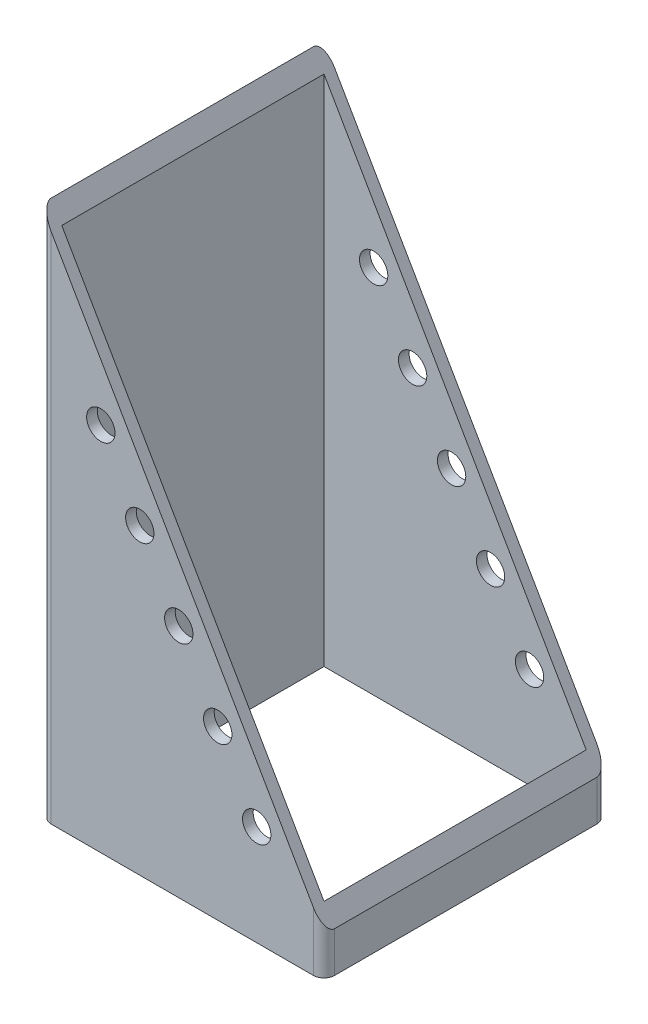
ISO-10303-21;
HEADER;
FILE_DESCRIPTION(('STEP AP214'),'2;1');
FILE_NAME('part.step','',(''),(''),'','','');
FILE_SCHEMA(('AUTOMOTIVE_DESIGN { 1 0 10303 214 1 1 1 1 }'));
ENDSEC;
DATA;
#1=APPLICATION_CONTEXT('core data for automotive mechanical design processes');
#2=APPLICATION_PROTOCOL_DEFINITION('international standard','automotive_design',2000,#1);
#3=PRODUCT_CONTEXT('',#1,'mechanical');
#4=PRODUCT('Part','Part','',(#3));
#5=PRODUCT_RELATED_PRODUCT_CATEGORY('part','',(#4));
#6=PRODUCT_DEFINITION_FORMATION('','',#4);
#7=PRODUCT_DEFINITION_CONTEXT('part definition',#1,'design');
#8=PRODUCT_DEFINITION('design','',#6,#7);
#9=PRODUCT_DEFINITION_SHAPE('','',#8);
#10=(LENGTH_UNIT() NAMED_UNIT(*) SI_UNIT(.MILLI.,.METRE.));
#11=(NAMED_UNIT(*) PLANE_ANGLE_UNIT() SI_UNIT($,.RADIAN.));
#12=(NAMED_UNIT(*) SI_UNIT($,.STERADIAN.) SOLID_ANGLE_UNIT());
#13=UNCERTAINTY_MEASURE_WITH_UNIT(LENGTH_MEASURE(1.E-05),#10,'distance_accuracy_value','');
#14=(GEOMETRIC_REPRESENTATION_CONTEXT(3) GLOBAL_UNCERTAINTY_ASSIGNED_CONTEXT((#13)) GLOBAL_UNIT_ASSIGNED_CONTEXT((#10,
#11,#12)) REPRESENTATION_CONTEXT('',''));
#15=CARTESIAN_POINT('',(0.,0.,0.));
#16=DIRECTION('',(0.,0.,1.));
#17=DIRECTION('',(1.,0.,0.));
#18=AXIS2_PLACEMENT_3D('',#15,#16,#17);
#19=CARTESIAN_POINT('',(-40.,150.,-40.01));
#20=DIRECTION('',(-0.866025403784442,-0.499999999999995,0.));
#21=DIRECTION('',(0.499999999999995,-0.866025403784442,0.));
#22=AXIS2_PLACEMENT_3D('',#19,#20,#21);
#23=PLANE('',#22);
#24=DIRECTION('',(0.,0.,1.));
#25=VECTOR('',#24,1.);
#26=CARTESIAN_POINT('',(37.,16.6320878171947,-37.0000000000002));
#27=LINE('',#26,#25);
#28=CARTESIAN_POINT('',(37.,16.6320878171946,-37.));
#29=VERTEX_POINT('',#28);
#30=CARTESIAN_POINT('',(37.,16.6320878171946,37.));
#31=VERTEX_POINT('',#30);
#32=EDGE_CURVE('E135',#29,#31,#27,.T.);
#33=ORIENTED_EDGE('',*,*,#32,.T.);
#34=DIRECTION('',(-0.499999999999995,0.866025403784442,0.));
#35=VECTOR('',#34,1.);
#36=CARTESIAN_POINT('',(-104.201905283832,261.200961894324,37.));
#37=LINE('',#36,#35);
#38=CARTESIAN_POINT('',(-37.,144.803847577293,37.));
#39=VERTEX_POINT('',#38);
#40=EDGE_CURVE('E218',#31,#39,#37,.T.);
#41=ORIENTED_EDGE('',*,*,#40,.T.);
#42=DIRECTION('',(0.,0.,-1.));
#43=VECTOR('',#42,1.);
#44=CARTESIAN_POINT('',(-37.,144.803847577293,-37.0000000000001));
#45=LINE('',#44,#43);
#46=CARTESIAN_POINT('',(-37.,144.803847577293,-37.));
#47=VERTEX_POINT('',#46);
#48=EDGE_CURVE('E221',#39,#47,#45,.T.);
#49=ORIENTED_EDGE('',*,*,#48,.T.);
#50=DIRECTION('',(0.499999999999995,-0.866025403784442,0.));
#51=VECTOR('',#50,1.);
#52=CARTESIAN_POINT('',(-104.201905283832,261.200961894324,-37.));
#53=LINE('',#52,#51);
#54=EDGE_CURVE('E224',#47,#29,#53,.T.);
#55=ORIENTED_EDGE('',*,*,#54,.T.);
#56=EDGE_LOOP('',(#33,#41,#49,#55));
#57=FACE_BOUND('',#56,.T.);
#58=CARTESIAN_POINT('',(-37.,144.803847577293,37.));
#59=DIRECTION('',(-0.866025403784442,-0.499999999999995,0.));
#60=DIRECTION('',(0.499999999999995,-0.866025403784442,0.));
#61=AXIS2_PLACEMENT_3D('',#58,#59,#60);
#62=ELLIPSE('',#61,6.00000000000006,3.);
#63=CARTESIAN_POINT('',(-40.,150.,37.));
#64=VERTEX_POINT('',#63);
#65=CARTESIAN_POINT('',(-37.,144.803847577293,40.));
#66=VERTEX_POINT('',#65);
#67=EDGE_CURVE('E215',#64,#66,#62,.F.);
#68=ORIENTED_EDGE('',*,*,#67,.T.);
#69=DIRECTION('',(-0.499999999999995,0.866025403784442,0.));
#70=VECTOR('',#69,1.);
#71=CARTESIAN_POINT('',(-104.951905283832,262.500000000001,40.));
#72=LINE('',#71,#70);
#73=CARTESIAN_POINT('',(37.,16.6320878171947,40.));
#74=VERTEX_POINT('',#73);
#75=EDGE_CURVE('E202',#74,#66,#72,.T.);
#76=ORIENTED_EDGE('',*,*,#75,.F.);
#77=CARTESIAN_POINT('',(37.,16.6320878171947,37.));
#78=DIRECTION('',(-0.866025403784442,-0.499999999999995,0.));
#79=DIRECTION('',(0.499999999999995,-0.866025403784442,0.));
#80=AXIS2_PLACEMENT_3D('',#77,#78,#79);
#81=ELLIPSE('',#80,6.00000000000006,3.);
#82=CARTESIAN_POINT('',(40.,11.435935394488,37.));
#83=VERTEX_POINT('',#82);
#84=EDGE_CURVE('E44',#74,#83,#81,.F.);
#85=ORIENTED_EDGE('',*,*,#84,.T.);
#86=DIRECTION('',(0.,0.,1.));
#87=VECTOR('',#86,1.);
#88=CARTESIAN_POINT('',(40.,11.435935394488,-40.0000000000001));
#89=LINE('',#88,#87);
#90=CARTESIAN_POINT('',(40.,11.435935394488,-37.));
#91=VERTEX_POINT('',#90);
#92=EDGE_CURVE('E208',#91,#83,#89,.T.);
#93=ORIENTED_EDGE('',*,*,#92,.F.);
#94=CARTESIAN_POINT('',(37.,16.6320878171947,-37.));
#95=DIRECTION('',(-0.866025403784442,-0.499999999999995,0.));
#96=DIRECTION('',(0.499999999999995,-0.866025403784442,0.));
#97=AXIS2_PLACEMENT_3D('',#94,#95,#96);
#98=ELLIPSE('',#97,6.00000000000006,3.);
#99=CARTESIAN_POINT('',(37.,16.6320878171947,-40.));
#100=VERTEX_POINT('',#99);
#101=EDGE_CURVE('E11',#91,#100,#98,.F.);
#102=ORIENTED_EDGE('',*,*,#101,.T.);
#103=DIRECTION('',(0.499999999999995,-0.866025403784442,0.));
#104=VECTOR('',#103,1.);
#105=CARTESIAN_POINT('',(-104.951905283832,262.500000000001,-40.));
#106=LINE('',#105,#104);
#107=CARTESIAN_POINT('',(-37.,144.803847577293,-40.));
#108=VERTEX_POINT('',#107);
#109=EDGE_CURVE('E58',#108,#100,#106,.T.);
#110=ORIENTED_EDGE('',*,*,#109,.F.);
#111=CARTESIAN_POINT('',(-37.,144.803847577293,-37.));
#112=DIRECTION('',(-0.866025403784442,-0.499999999999995,0.));
#113=DIRECTION('',(0.499999999999995,-0.866025403784442,0.));
#114=AXIS2_PLACEMENT_3D('',#111,#112,#113);
#115=ELLIPSE('',#114,6.00000000000006,3.);
#116=CARTESIAN_POINT('',(-40.,150.,-37.));
#117=VERTEX_POINT('',#116);
#118=EDGE_CURVE('E212',#108,#117,#115,.F.);
#119=ORIENTED_EDGE('',*,*,#118,.T.);
#120=DIRECTION('',(0.,0.,-1.));
#121=VECTOR('',#120,1.);
#122=CARTESIAN_POINT('',(-40.,150.,-40.0000000000001));
#123=LINE('',#122,#121);
#124=EDGE_CURVE('E205',#64,#117,#123,.T.);
#125=ORIENTED_EDGE('',*,*,#124,.F.);
#126=EDGE_LOOP('',(#68,#76,#85,#93,#102,#110,#119,#125));
#127=FACE_BOUND('',#126,.T.);
#128=ADVANCED_FACE('F36',(#57,#127),#23,.F.);
#129=CARTESIAN_POINT('',(0.,0.,0.));
#130=DIRECTION('',(0.,1.,0.));
#131=DIRECTION('',(0.,0.,1.));
#132=AXIS2_PLACEMENT_3D('',#129,#130,#131);
#133=PLANE('',#132);
#134=DIRECTION('',(1.,0.,0.));
#135=VECTOR('',#134,1.);
#136=CARTESIAN_POINT('',(-40.,0.,40.));
#137=LINE('',#136,#135);
#138=CARTESIAN_POINT('',(-37.,0.,40.));
#139=VERTEX_POINT('',#138);
#140=CARTESIAN_POINT('',(37.,0.,40.));
#141=VERTEX_POINT('',#140);
#142=EDGE_CURVE('E173',#139,#141,#137,.T.);
#143=ORIENTED_EDGE('',*,*,#142,.F.);
#144=CARTESIAN_POINT('',(-37.,0.,37.));
#145=DIRECTION('',(0.,1.,0.));
#146=DIRECTION('',(0.,0.,1.));
#147=AXIS2_PLACEMENT_3D('',#144,#145,#146);
#148=CIRCLE('',#147,3.);
#149=CARTESIAN_POINT('',(-40.,0.,37.));
#150=VERTEX_POINT('',#149);
#151=EDGE_CURVE('E187',#139,#150,#148,.F.);
#152=ORIENTED_EDGE('',*,*,#151,.T.);
#153=DIRECTION('',(0.,0.,1.));
#154=VECTOR('',#153,1.);
#155=CARTESIAN_POINT('',(-40.,0.,-40.));
#156=LINE('',#155,#154);
#157=CARTESIAN_POINT('',(-40.,0.,-37.));
#158=VERTEX_POINT('',#157);
#159=EDGE_CURVE('E170',#158,#150,#156,.T.);
#160=ORIENTED_EDGE('',*,*,#159,.F.);
#161=CARTESIAN_POINT('',(-37.,0.,-37.));
#162=DIRECTION('',(0.,1.,0.));
#163=DIRECTION('',(0.,0.,1.));
#164=AXIS2_PLACEMENT_3D('',#161,#162,#163);
#165=CIRCLE('',#164,3.);
#166=CARTESIAN_POINT('',(-37.,0.,-40.));
#167=VERTEX_POINT('',#166);
#168=EDGE_CURVE('E185',#158,#167,#165,.F.);
#169=ORIENTED_EDGE('',*,*,#168,.T.);
#170=DIRECTION('',(-1.,0.,0.));
#171=VECTOR('',#170,1.);
#172=CARTESIAN_POINT('',(-40.,0.,-40.));
#173=LINE('',#172,#171);
#174=CARTESIAN_POINT('',(37.,0.,-40.));
#175=VERTEX_POINT('',#174);
#176=EDGE_CURVE('E167',#175,#167,#173,.T.);
#177=ORIENTED_EDGE('',*,*,#176,.F.);
#178=CARTESIAN_POINT('',(37.,0.,-37.));
#179=DIRECTION('',(0.,1.,0.));
#180=DIRECTION('',(0.,0.,1.));
#181=AXIS2_PLACEMENT_3D('',#178,#179,#180);
#182=CIRCLE('',#181,3.);
#183=CARTESIAN_POINT('',(40.,0.,-37.));
#184=VERTEX_POINT('',#183);
#185=EDGE_CURVE('E181',#175,#184,#182,.F.);
#186=ORIENTED_EDGE('',*,*,#185,.T.);
#187=DIRECTION('',(0.,0.,-1.));
#188=VECTOR('',#187,1.);
#189=CARTESIAN_POINT('',(40.,0.,-40.));
#190=LINE('',#189,#188);
#191=CARTESIAN_POINT('',(40.,0.,37.));
#192=VERTEX_POINT('',#191);
#193=EDGE_CURVE('E137',#192,#184,#190,.T.);
#194=ORIENTED_EDGE('',*,*,#193,.F.);
#195=CARTESIAN_POINT('',(37.,0.,37.));
#196=DIRECTION('',(0.,1.,0.));
#197=DIRECTION('',(0.,0.,1.));
#198=AXIS2_PLACEMENT_3D('',#195,#196,#197);
#199=CIRCLE('',#198,3.);
#200=EDGE_CURVE('E183',#192,#141,#199,.F.);
#201=ORIENTED_EDGE('',*,*,#200,.T.);
#202=EDGE_LOOP('',(#143,#152,#160,#169,#177,#186,#194,#201));
#203=FACE_BOUND('',#202,.T.);
#204=DIRECTION('',(0.,0.,-1.));
#205=VECTOR('',#204,1.);
#206=CARTESIAN_POINT('',(37.,0.,-37.));
#207=LINE('',#206,#205);
#208=CARTESIAN_POINT('',(37.,0.,37.));
#209=VERTEX_POINT('',#208);
#210=CARTESIAN_POINT('',(37.,0.,-37.));
#211=VERTEX_POINT('',#210);
#212=EDGE_CURVE('E132',#209,#211,#207,.T.);
#213=ORIENTED_EDGE('',*,*,#212,.T.);
#214=DIRECTION('',(-1.,0.,0.));
#215=VECTOR('',#214,1.);
#216=CARTESIAN_POINT('',(-37.,0.,-37.));
#217=LINE('',#216,#215);
#218=CARTESIAN_POINT('',(-37.,0.,-37.));
#219=VERTEX_POINT('',#218);
#220=EDGE_CURVE('E141',#211,#219,#217,.T.);
#221=ORIENTED_EDGE('',*,*,#220,.T.);
#222=DIRECTION('',(0.,0.,1.));
#223=VECTOR('',#222,1.);
#224=CARTESIAN_POINT('',(-37.,0.,-37.));
#225=LINE('',#224,#223);
#226=CARTESIAN_POINT('',(-37.,0.,37.));
#227=VERTEX_POINT('',#226);
#228=EDGE_CURVE('E147',#219,#227,#225,.T.);
#229=ORIENTED_EDGE('',*,*,#228,.T.);
#230=DIRECTION('',(1.,0.,0.));
#231=VECTOR('',#230,1.);
#232=CARTESIAN_POINT('',(-37.,0.,37.));
#233=LINE('',#232,#231);
#234=EDGE_CURVE('E151',#227,#209,#233,.T.);
#235=ORIENTED_EDGE('',*,*,#234,.T.);
#236=EDGE_LOOP('',(#213,#221,#229,#235));
#237=FACE_BOUND('',#236,.T.);
#238=ADVANCED_FACE('F149',(#203,#237),#133,.F.);
#239=CARTESIAN_POINT('',(40.,300.,-40.));
#240=DIRECTION('',(-1.,0.,0.));
#241=DIRECTION('',(0.,0.,1.));
#242=AXIS2_PLACEMENT_3D('',#239,#240,#241);
#243=PLANE('',#242);
#244=DIRECTION('',(0.,-1.,0.));
#245=VECTOR('',#244,1.);
#246=CARTESIAN_POINT('',(40.,300.,-37.));
#247=LINE('',#246,#245);
#248=EDGE_CURVE('E198',#184,#91,#247,.F.);
#249=ORIENTED_EDGE('',*,*,#248,.T.);
#250=ORIENTED_EDGE('',*,*,#92,.T.);
#251=DIRECTION('',(0.,-1.,0.));
#252=VECTOR('',#251,1.);
#253=CARTESIAN_POINT('',(40.,300.,37.));
#254=LINE('',#253,#252);
#255=EDGE_CURVE('E201',#83,#192,#254,.T.);
#256=ORIENTED_EDGE('',*,*,#255,.T.);
#257=ORIENTED_EDGE('',*,*,#193,.T.);
#258=EDGE_LOOP('',(#249,#250,#256,#257));
#259=FACE_BOUND('',#258,.T.);
#260=ADVANCED_FACE('F314',(#259),#243,.F.);
#261=CARTESIAN_POINT('',(-40.,300.,-40.));
#262=DIRECTION('',(0.,0.,1.));
#263=DIRECTION('',(1.,0.,0.));
#264=AXIS2_PLACEMENT_3D('',#261,#262,#263);
#265=PLANE('',#264);
#266=CARTESIAN_POINT('',(-22.9881489732215,104.534609690826,-40.));
#267=DIRECTION('',(0.,0.,-1.));
#268=DIRECTION('',(-1.,0.,0.));
#269=AXIS2_PLACEMENT_3D('',#266,#267,#268);
#270=CIRCLE('',#269,4.00000000000001);
#271=CARTESIAN_POINT('',(-26.9881489732215,104.534609690826,-40.));
#272=VERTEX_POINT('',#271);
#273=EDGE_CURVE('E260',#272,#272,#270,.T.);
#274=ORIENTED_EDGE('',*,*,#273,.F.);
#275=EDGE_LOOP('',(#274));
#276=FACE_BOUND('',#275,.T.);
#277=CARTESIAN_POINT('',(-11.9881489732214,85.4820508075689,-40.));
#278=DIRECTION('',(0.,0.,-1.));
#279=DIRECTION('',(-1.,0.,0.));
#280=AXIS2_PLACEMENT_3D('',#277,#278,#279);
#281=CIRCLE('',#280,4.00000000000001);
#282=CARTESIAN_POINT('',(-15.9881489732214,85.4820508075689,-40.));
#283=VERTEX_POINT('',#282);
#284=EDGE_CURVE('E267',#283,#283,#281,.T.);
#285=ORIENTED_EDGE('',*,*,#284,.F.);
#286=EDGE_LOOP('',(#285));
#287=FACE_BOUND('',#286,.T.);
#288=CARTESIAN_POINT('',(21.0118510267788,28.324374157796,-40.));
#289=DIRECTION('',(0.,0.,-1.));
#290=DIRECTION('',(-1.,0.,0.));
#291=AXIS2_PLACEMENT_3D('',#288,#289,#290);
#292=CIRCLE('',#291,4.00000000000001);
#293=CARTESIAN_POINT('',(17.0118510267788,28.324374157796,-40.));
#294=VERTEX_POINT('',#293);
#295=EDGE_CURVE('E273',#294,#294,#292,.T.);
#296=ORIENTED_EDGE('',*,*,#295,.F.);
#297=EDGE_LOOP('',(#296));
#298=FACE_BOUND('',#297,.T.);
#299=CARTESIAN_POINT('',(10.0118510267787,47.3769330410536,-40.));
#300=DIRECTION('',(0.,0.,-1.));
#301=DIRECTION('',(-1.,0.,0.));
#302=AXIS2_PLACEMENT_3D('',#299,#300,#301);
#303=CIRCLE('',#302,4.00000000000001);
#304=CARTESIAN_POINT('',(6.01185102677873,47.3769330410536,-40.));
#305=VERTEX_POINT('',#304);
#306=EDGE_CURVE('E259',#305,#305,#303,.T.);
#307=ORIENTED_EDGE('',*,*,#306,.F.);
#308=EDGE_LOOP('',(#307));
#309=FACE_BOUND('',#308,.T.);
#310=CARTESIAN_POINT('',(-0.988148973221331,66.4294919243113,-40.));
#311=DIRECTION('',(0.,0.,-1.));
#312=DIRECTION('',(-1.,0.,0.));
#313=AXIS2_PLACEMENT_3D('',#310,#311,#312);
#314=CIRCLE('',#313,4.00000000000001);
#315=CARTESIAN_POINT('',(-4.98814897322134,66.4294919243113,-40.));
#316=VERTEX_POINT('',#315);
#317=EDGE_CURVE('E231',#316,#316,#314,.T.);
#318=ORIENTED_EDGE('',*,*,#317,.F.);
#319=EDGE_LOOP('',(#318));
#320=FACE_BOUND('',#319,.T.);
#321=DIRECTION('',(0.,-1.,0.));
#322=VECTOR('',#321,1.);
#323=CARTESIAN_POINT('',(-37.,300.,-40.));
#324=LINE('',#323,#322);
#325=EDGE_CURVE('E196',#167,#108,#324,.F.);
#326=ORIENTED_EDGE('',*,*,#325,.T.);
#327=ORIENTED_EDGE('',*,*,#109,.T.);
#328=DIRECTION('',(0.,-1.,0.));
#329=VECTOR('',#328,1.);
#330=CARTESIAN_POINT('',(37.,300.,-40.));
#331=LINE('',#330,#329);
#332=EDGE_CURVE('E194',#100,#175,#331,.T.);
#333=ORIENTED_EDGE('',*,*,#332,.T.);
#334=ORIENTED_EDGE('',*,*,#176,.T.);
#335=EDGE_LOOP('',(#326,#327,#333,#334));
#336=FACE_BOUND('',#335,.T.);
#337=ADVANCED_FACE('F337',(#276,#287,#298,#309,#320,#336),#265,.F.);
#338=CARTESIAN_POINT('',(-40.,300.,-40.));
#339=DIRECTION('',(1.,0.,0.));
#340=DIRECTION('',(0.,0.,-1.));
#341=AXIS2_PLACEMENT_3D('',#338,#339,#340);
#342=PLANE('',#341);
#343=DIRECTION('',(0.,-1.,0.));
#344=VECTOR('',#343,1.);
#345=CARTESIAN_POINT('',(-40.,300.,37.));
#346=LINE('',#345,#344);
#347=EDGE_CURVE('E191',#150,#64,#346,.F.);
#348=ORIENTED_EDGE('',*,*,#347,.T.);
#349=ORIENTED_EDGE('',*,*,#124,.T.);
#350=DIRECTION('',(0.,-1.,0.));
#351=VECTOR('',#350,1.);
#352=CARTESIAN_POINT('',(-40.,300.,-37.));
#353=LINE('',#352,#351);
#354=EDGE_CURVE('E189',#117,#158,#353,.T.);
#355=ORIENTED_EDGE('',*,*,#354,.T.);
#356=ORIENTED_EDGE('',*,*,#159,.T.);
#357=EDGE_LOOP('',(#348,#349,#355,#356));
#358=FACE_BOUND('',#357,.T.);
#359=ADVANCED_FACE('F341',(#358),#342,.F.);
#360=CARTESIAN_POINT('',(-40.,300.,40.));
#361=DIRECTION('',(0.,0.,-1.));
#362=DIRECTION('',(-1.,0.,0.));
#363=AXIS2_PLACEMENT_3D('',#360,#361,#362);
#364=PLANE('',#363);
#365=CARTESIAN_POINT('',(-22.9881489732215,104.534609690826,40.));
#366=DIRECTION('',(0.,0.,-1.));
#367=DIRECTION('',(-1.,0.,0.));
#368=AXIS2_PLACEMENT_3D('',#365,#366,#367);
#369=CIRCLE('',#368,4.00000000000001);
#370=CARTESIAN_POINT('',(-26.9881489732215,104.534609690826,40.));
#371=VERTEX_POINT('',#370);
#372=EDGE_CURVE('E264',#371,#371,#369,.T.);
#373=ORIENTED_EDGE('',*,*,#372,.T.);
#374=EDGE_LOOP('',(#373));
#375=FACE_BOUND('',#374,.T.);
#376=CARTESIAN_POINT('',(-11.9881489732214,85.4820508075689,40.));
#377=DIRECTION('',(0.,0.,-1.));
#378=DIRECTION('',(-1.,0.,0.));
#379=AXIS2_PLACEMENT_3D('',#376,#377,#378);
#380=CIRCLE('',#379,4.00000000000001);
#381=CARTESIAN_POINT('',(-15.9881489732214,85.4820508075689,40.));
#382=VERTEX_POINT('',#381);
#383=EDGE_CURVE('E263',#382,#382,#380,.T.);
#384=ORIENTED_EDGE('',*,*,#383,.T.);
#385=EDGE_LOOP('',(#384));
#386=FACE_BOUND('',#385,.T.);
#387=CARTESIAN_POINT('',(21.0118510267788,28.324374157796,40.));
#388=DIRECTION('',(0.,0.,-1.));
#389=DIRECTION('',(-1.,0.,0.));
#390=AXIS2_PLACEMENT_3D('',#387,#388,#389);
#391=CIRCLE('',#390,4.00000000000001);
#392=CARTESIAN_POINT('',(17.0118510267788,28.324374157796,40.));
#393=VERTEX_POINT('',#392);
#394=EDGE_CURVE('E270',#393,#393,#391,.T.);
#395=ORIENTED_EDGE('',*,*,#394,.T.);
#396=EDGE_LOOP('',(#395));
#397=FACE_BOUND('',#396,.T.);
#398=CARTESIAN_POINT('',(10.0118510267788,47.3769330410536,40.));
#399=DIRECTION('',(0.,0.,-1.));
#400=DIRECTION('',(-1.,0.,0.));
#401=AXIS2_PLACEMENT_3D('',#398,#399,#400);
#402=CIRCLE('',#401,4.00000000000001);
#403=CARTESIAN_POINT('',(6.01185102677874,47.3769330410536,40.));
#404=VERTEX_POINT('',#403);
#405=EDGE_CURVE('E276',#404,#404,#402,.T.);
#406=ORIENTED_EDGE('',*,*,#405,.T.);
#407=EDGE_LOOP('',(#406));
#408=FACE_BOUND('',#407,.T.);
#409=CARTESIAN_POINT('',(-0.988148973221317,66.4294919243113,40.));
#410=DIRECTION('',(0.,0.,-1.));
#411=DIRECTION('',(-1.,0.,0.));
#412=AXIS2_PLACEMENT_3D('',#409,#410,#411);
#413=CIRCLE('',#412,4.00000000000001);
#414=CARTESIAN_POINT('',(-4.98814897322132,66.4294919243113,40.));
#415=VERTEX_POINT('',#414);
#416=EDGE_CURVE('E256',#415,#415,#413,.T.);
#417=ORIENTED_EDGE('',*,*,#416,.T.);
#418=EDGE_LOOP('',(#417));
#419=FACE_BOUND('',#418,.T.);
#420=DIRECTION('',(0.,-1.,0.));
#421=VECTOR('',#420,1.);
#422=CARTESIAN_POINT('',(37.,300.,40.));
#423=LINE('',#422,#421);
#424=EDGE_CURVE('E176',#141,#74,#423,.F.);
#425=ORIENTED_EDGE('',*,*,#424,.T.);
#426=ORIENTED_EDGE('',*,*,#75,.T.);
#427=DIRECTION('',(0.,-1.,0.));
#428=VECTOR('',#427,1.);
#429=CARTESIAN_POINT('',(-37.,300.,40.));
#430=LINE('',#429,#428);
#431=EDGE_CURVE('E179',#66,#139,#430,.T.);
#432=ORIENTED_EDGE('',*,*,#431,.T.);
#433=ORIENTED_EDGE('',*,*,#142,.T.);
#434=EDGE_LOOP('',(#425,#426,#432,#433));
#435=FACE_BOUND('',#434,.T.);
#436=ADVANCED_FACE('F284',(#375,#386,#397,#408,#419,#435),#364,.F.);
#437=CARTESIAN_POINT('',(37.,300.,-37.));
#438=DIRECTION('',(-1.,0.,0.));
#439=DIRECTION('',(0.,0.,1.));
#440=AXIS2_PLACEMENT_3D('',#437,#438,#439);
#441=PLANE('',#440);
#442=ORIENTED_EDGE('',*,*,#32,.F.);
#443=DIRECTION('',(0.,-1.,0.));
#444=VECTOR('',#443,1.);
#445=CARTESIAN_POINT('',(37.,300.,-37.));
#446=LINE('',#445,#444);
#447=EDGE_CURVE('E127',#29,#211,#446,.T.);
#448=ORIENTED_EDGE('',*,*,#447,.T.);
#449=ORIENTED_EDGE('',*,*,#212,.F.);
#450=DIRECTION('',(0.,-1.,0.));
#451=VECTOR('',#450,1.);
#452=CARTESIAN_POINT('',(37.,300.,37.));
#453=LINE('',#452,#451);
#454=EDGE_CURVE('E160',#31,#209,#453,.T.);
#455=ORIENTED_EDGE('',*,*,#454,.F.);
#456=EDGE_LOOP('',(#442,#448,#449,#455));
#457=FACE_BOUND('',#456,.T.);
#458=ADVANCED_FACE('F129',(#457),#441,.T.);
#459=CARTESIAN_POINT('',(-37.,300.,-37.));
#460=DIRECTION('',(0.,0.,1.));
#461=DIRECTION('',(1.,0.,0.));
#462=AXIS2_PLACEMENT_3D('',#459,#460,#461);
#463=PLANE('',#462);
#464=CARTESIAN_POINT('',(-22.9881489732215,104.534609690826,-37.));
#465=DIRECTION('',(0.,0.,1.));
#466=DIRECTION('',(1.,0.,0.));
#467=AXIS2_PLACEMENT_3D('',#464,#465,#466);
#468=CIRCLE('',#467,4.00000000000001);
#469=CARTESIAN_POINT('',(-18.9881489732215,104.534609690826,-37.));
#470=VERTEX_POINT('',#469);
#471=EDGE_CURVE('E152',#470,#470,#468,.F.);
#472=ORIENTED_EDGE('',*,*,#471,.T.);
#473=EDGE_LOOP('',(#472));
#474=FACE_BOUND('',#473,.T.);
#475=CARTESIAN_POINT('',(-11.9881489732214,85.4820508075689,-37.));
#476=DIRECTION('',(0.,0.,1.));
#477=DIRECTION('',(1.,0.,0.));
#478=AXIS2_PLACEMENT_3D('',#475,#476,#477);
#479=CIRCLE('',#478,4.00000000000001);
#480=CARTESIAN_POINT('',(-7.98814897322139,85.4820508075689,-37.));
#481=VERTEX_POINT('',#480);
#482=EDGE_CURVE('E241',#481,#481,#479,.F.);
#483=ORIENTED_EDGE('',*,*,#482,.T.);
#484=EDGE_LOOP('',(#483));
#485=FACE_BOUND('',#484,.T.);
#486=CARTESIAN_POINT('',(21.0118510267788,28.324374157796,-37.));
#487=DIRECTION('',(0.,0.,1.));
#488=DIRECTION('',(1.,0.,0.));
#489=AXIS2_PLACEMENT_3D('',#486,#487,#488);
#490=CIRCLE('',#489,4.00000000000001);
#491=CARTESIAN_POINT('',(25.0118510267788,28.324374157796,-37.));
#492=VERTEX_POINT('',#491);
#493=EDGE_CURVE('E238',#492,#492,#490,.F.);
#494=ORIENTED_EDGE('',*,*,#493,.T.);
#495=EDGE_LOOP('',(#494));
#496=FACE_BOUND('',#495,.T.);
#497=CARTESIAN_POINT('',(10.0118510267787,47.3769330410536,-37.));
#498=DIRECTION('',(0.,0.,1.));
#499=DIRECTION('',(1.,0.,0.));
#500=AXIS2_PLACEMENT_3D('',#497,#498,#499);
#501=CIRCLE('',#500,4.00000000000001);
#502=CARTESIAN_POINT('',(14.0118510267788,47.3769330410536,-37.));
#503=VERTEX_POINT('',#502);
#504=EDGE_CURVE('E235',#503,#503,#501,.F.);
#505=ORIENTED_EDGE('',*,*,#504,.T.);
#506=EDGE_LOOP('',(#505));
#507=FACE_BOUND('',#506,.T.);
#508=CARTESIAN_POINT('',(-0.98814897322133,66.4294919243113,-37.));
#509=DIRECTION('',(0.,0.,1.));
#510=DIRECTION('',(1.,0.,0.));
#511=AXIS2_PLACEMENT_3D('',#508,#509,#510);
#512=CIRCLE('',#511,4.00000000000001);
#513=CARTESIAN_POINT('',(3.01185102677868,66.4294919243113,-37.));
#514=VERTEX_POINT('',#513);
#515=EDGE_CURVE('E230',#514,#514,#512,.F.);
#516=ORIENTED_EDGE('',*,*,#515,.T.);
#517=EDGE_LOOP('',(#516));
#518=FACE_BOUND('',#517,.T.);
#519=ORIENTED_EDGE('',*,*,#54,.F.);
#520=DIRECTION('',(0.,-1.,0.));
#521=VECTOR('',#520,1.);
#522=CARTESIAN_POINT('',(-37.,300.,-37.));
#523=LINE('',#522,#521);
#524=EDGE_CURVE('E138',#47,#219,#523,.T.);
#525=ORIENTED_EDGE('',*,*,#524,.T.);
#526=ORIENTED_EDGE('',*,*,#220,.F.);
#527=ORIENTED_EDGE('',*,*,#447,.F.);
#528=EDGE_LOOP('',(#519,#525,#526,#527));
#529=FACE_BOUND('',#528,.T.);
#530=ADVANCED_FACE('F142',(#474,#485,#496,#507,#518,#529),#463,.T.);
#531=CARTESIAN_POINT('',(-37.,300.,-37.));
#532=DIRECTION('',(1.,0.,0.));
#533=DIRECTION('',(0.,0.,-1.));
#534=AXIS2_PLACEMENT_3D('',#531,#532,#533);
#535=PLANE('',#534);
#536=ORIENTED_EDGE('',*,*,#48,.F.);
#537=DIRECTION('',(0.,-1.,0.));
#538=VECTOR('',#537,1.);
#539=CARTESIAN_POINT('',(-37.,300.,37.));
#540=LINE('',#539,#538);
#541=EDGE_CURVE('E162',#39,#227,#540,.T.);
#542=ORIENTED_EDGE('',*,*,#541,.T.);
#543=ORIENTED_EDGE('',*,*,#228,.F.);
#544=ORIENTED_EDGE('',*,*,#524,.F.);
#545=EDGE_LOOP('',(#536,#542,#543,#544));
#546=FACE_BOUND('',#545,.T.);
#547=ADVANCED_FACE('F353',(#546),#535,.T.);
#548=CARTESIAN_POINT('',(-37.,300.,37.));
#549=DIRECTION('',(0.,0.,-1.));
#550=DIRECTION('',(-1.,0.,0.));
#551=AXIS2_PLACEMENT_3D('',#548,#549,#550);
#552=PLANE('',#551);
#553=CARTESIAN_POINT('',(-22.9881489732215,104.534609690826,37.));
#554=DIRECTION('',(0.,0.,-1.));
#555=DIRECTION('',(-1.,0.,0.));
#556=AXIS2_PLACEMENT_3D('',#553,#554,#555);
#557=CIRCLE('',#556,4.00000000000001);
#558=CARTESIAN_POINT('',(-26.9881489732215,104.534609690826,37.));
#559=VERTEX_POINT('',#558);
#560=EDGE_CURVE('E39',#559,#559,#557,.F.);
#561=ORIENTED_EDGE('',*,*,#560,.T.);
#562=EDGE_LOOP('',(#561));
#563=FACE_BOUND('',#562,.T.);
#564=CARTESIAN_POINT('',(-11.9881489732214,85.4820508075689,37.));
#565=DIRECTION('',(0.,0.,-1.));
#566=DIRECTION('',(-1.,0.,0.));
#567=AXIS2_PLACEMENT_3D('',#564,#565,#566);
#568=CIRCLE('',#567,4.00000000000001);
#569=CARTESIAN_POINT('',(-15.9881489732214,85.4820508075689,37.));
#570=VERTEX_POINT('',#569);
#571=EDGE_CURVE('E239',#570,#570,#568,.F.);
#572=ORIENTED_EDGE('',*,*,#571,.T.);
#573=EDGE_LOOP('',(#572));
#574=FACE_BOUND('',#573,.T.);
#575=CARTESIAN_POINT('',(21.0118510267788,28.324374157796,37.));
#576=DIRECTION('',(0.,0.,-1.));
#577=DIRECTION('',(-1.,0.,0.));
#578=AXIS2_PLACEMENT_3D('',#575,#576,#577);
#579=CIRCLE('',#578,4.00000000000001);
#580=CARTESIAN_POINT('',(17.0118510267788,28.324374157796,37.));
#581=VERTEX_POINT('',#580);
#582=EDGE_CURVE('E236',#581,#581,#579,.F.);
#583=ORIENTED_EDGE('',*,*,#582,.T.);
#584=EDGE_LOOP('',(#583));
#585=FACE_BOUND('',#584,.T.);
#586=CARTESIAN_POINT('',(10.0118510267788,47.3769330410536,37.));
#587=DIRECTION('',(0.,0.,-1.));
#588=DIRECTION('',(-1.,0.,0.));
#589=AXIS2_PLACEMENT_3D('',#586,#587,#588);
#590=CIRCLE('',#589,4.00000000000001);
#591=CARTESIAN_POINT('',(6.01185102677874,47.3769330410536,37.));
#592=VERTEX_POINT('',#591);
#593=EDGE_CURVE('E232',#592,#592,#590,.F.);
#594=ORIENTED_EDGE('',*,*,#593,.T.);
#595=EDGE_LOOP('',(#594));
#596=FACE_BOUND('',#595,.T.);
#597=CARTESIAN_POINT('',(-0.988148973221317,66.4294919243113,37.));
#598=DIRECTION('',(0.,0.,-1.));
#599=DIRECTION('',(-1.,0.,0.));
#600=AXIS2_PLACEMENT_3D('',#597,#598,#599);
#601=CIRCLE('',#600,4.00000000000001);
#602=CARTESIAN_POINT('',(-4.98814897322132,66.4294919243113,37.));
#603=VERTEX_POINT('',#602);
#604=EDGE_CURVE('E227',#603,#603,#601,.F.);
#605=ORIENTED_EDGE('',*,*,#604,.T.);
#606=EDGE_LOOP('',(#605));
#607=FACE_BOUND('',#606,.T.);
#608=ORIENTED_EDGE('',*,*,#40,.F.);
#609=ORIENTED_EDGE('',*,*,#454,.T.);
#610=ORIENTED_EDGE('',*,*,#234,.F.);
#611=ORIENTED_EDGE('',*,*,#541,.F.);
#612=EDGE_LOOP('',(#608,#609,#610,#611));
#613=FACE_BOUND('',#612,.T.);
#614=ADVANCED_FACE('F333',(#563,#574,#585,#596,#607,#613),#552,.T.);
#615=CARTESIAN_POINT('',(-37.,300.,37.));
#616=DIRECTION('',(0.,-1.,0.));
#617=DIRECTION('',(0.,0.,-1.));
#618=AXIS2_PLACEMENT_3D('',#615,#616,#617);
#619=CYLINDRICAL_SURFACE('',#618,3.);
#620=ORIENTED_EDGE('',*,*,#67,.F.);
#621=ORIENTED_EDGE('',*,*,#347,.F.);
#622=ORIENTED_EDGE('',*,*,#151,.F.);
#623=ORIENTED_EDGE('',*,*,#431,.F.);
#624=EDGE_LOOP('',(#620,#621,#622,#623));
#625=FACE_BOUND('',#624,.T.);
#626=ADVANCED_FACE('F329',(#625),#619,.T.);
#627=CARTESIAN_POINT('',(-37.,300.,-37.));
#628=DIRECTION('',(0.,-1.,0.));
#629=DIRECTION('',(0.,0.,-1.));
#630=AXIS2_PLACEMENT_3D('',#627,#628,#629);
#631=CYLINDRICAL_SURFACE('',#630,3.);
#632=ORIENTED_EDGE('',*,*,#118,.F.);
#633=ORIENTED_EDGE('',*,*,#325,.F.);
#634=ORIENTED_EDGE('',*,*,#168,.F.);
#635=ORIENTED_EDGE('',*,*,#354,.F.);
#636=EDGE_LOOP('',(#632,#633,#634,#635));
#637=FACE_BOUND('',#636,.T.);
#638=ADVANCED_FACE('F323',(#637),#631,.T.);
#639=CARTESIAN_POINT('',(37.,300.,37.));
#640=DIRECTION('',(0.,-1.,0.));
#641=DIRECTION('',(0.,0.,-1.));
#642=AXIS2_PLACEMENT_3D('',#639,#640,#641);
#643=CYLINDRICAL_SURFACE('',#642,3.);
#644=ORIENTED_EDGE('',*,*,#84,.F.);
#645=ORIENTED_EDGE('',*,*,#424,.F.);
#646=ORIENTED_EDGE('',*,*,#200,.F.);
#647=ORIENTED_EDGE('',*,*,#255,.F.);
#648=EDGE_LOOP('',(#644,#645,#646,#647));
#649=FACE_BOUND('',#648,.T.);
#650=ADVANCED_FACE('F319',(#649),#643,.T.);
#651=CARTESIAN_POINT('',(37.,300.,-37.));
#652=DIRECTION('',(0.,-1.,0.));
#653=DIRECTION('',(0.,0.,-1.));
#654=AXIS2_PLACEMENT_3D('',#651,#652,#653);
#655=CYLINDRICAL_SURFACE('',#654,3.);
#656=ORIENTED_EDGE('',*,*,#101,.F.);
#657=ORIENTED_EDGE('',*,*,#248,.F.);
#658=ORIENTED_EDGE('',*,*,#185,.F.);
#659=ORIENTED_EDGE('',*,*,#332,.F.);
#660=EDGE_LOOP('',(#656,#657,#658,#659));
#661=FACE_BOUND('',#660,.T.);
#662=ADVANCED_FACE('F302',(#661),#655,.T.);
#663=CARTESIAN_POINT('',(-0.988148973221331,66.4294919243113,-40.));
#664=DIRECTION('',(0.,0.,1.));
#665=DIRECTION('',(1.,0.,0.));
#666=AXIS2_PLACEMENT_3D('',#663,#664,#665);
#667=CYLINDRICAL_SURFACE('',#666,4.00000000000001);
#668=ORIENTED_EDGE('',*,*,#604,.F.);
#669=EDGE_LOOP('',(#668));
#670=FACE_BOUND('',#669,.T.);
#671=ORIENTED_EDGE('',*,*,#416,.F.);
#672=EDGE_LOOP('',(#671));
#673=FACE_BOUND('',#672,.T.);
#674=ADVANCED_FACE('F290',(#670,#673),#667,.F.);
#675=CARTESIAN_POINT('',(10.0118510267787,47.3769330410536,-40.));
#676=DIRECTION('',(0.,0.,1.));
#677=DIRECTION('',(1.,0.,0.));
#678=AXIS2_PLACEMENT_3D('',#675,#676,#677);
#679=CYLINDRICAL_SURFACE('',#678,4.00000000000001);
#680=ORIENTED_EDGE('',*,*,#593,.F.);
#681=EDGE_LOOP('',(#680));
#682=FACE_BOUND('',#681,.T.);
#683=ORIENTED_EDGE('',*,*,#405,.F.);
#684=EDGE_LOOP('',(#683));
#685=FACE_BOUND('',#684,.T.);
#686=ADVANCED_FACE('F287',(#682,#685),#679,.F.);
#687=CARTESIAN_POINT('',(21.0118510267788,28.324374157796,-40.));
#688=DIRECTION('',(0.,0.,1.));
#689=DIRECTION('',(1.,0.,0.));
#690=AXIS2_PLACEMENT_3D('',#687,#688,#689);
#691=CYLINDRICAL_SURFACE('',#690,4.00000000000001);
#692=ORIENTED_EDGE('',*,*,#582,.F.);
#693=EDGE_LOOP('',(#692));
#694=FACE_BOUND('',#693,.T.);
#695=ORIENTED_EDGE('',*,*,#394,.F.);
#696=EDGE_LOOP('',(#695));
#697=FACE_BOUND('',#696,.T.);
#698=ADVANCED_FACE('F289',(#694,#697),#691,.F.);
#699=CARTESIAN_POINT('',(-11.9881489732214,85.4820508075689,-40.));
#700=DIRECTION('',(0.,0.,1.));
#701=DIRECTION('',(1.,0.,0.));
#702=AXIS2_PLACEMENT_3D('',#699,#700,#701);
#703=CYLINDRICAL_SURFACE('',#702,4.00000000000001);
#704=ORIENTED_EDGE('',*,*,#571,.F.);
#705=EDGE_LOOP('',(#704));
#706=FACE_BOUND('',#705,.T.);
#707=ORIENTED_EDGE('',*,*,#383,.F.);
#708=EDGE_LOOP('',(#707));
#709=FACE_BOUND('',#708,.T.);
#710=ADVANCED_FACE('F298',(#706,#709),#703,.F.);
#711=CARTESIAN_POINT('',(-22.9881489732215,104.534609690826,-40.));
#712=DIRECTION('',(0.,0.,1.));
#713=DIRECTION('',(1.,0.,0.));
#714=AXIS2_PLACEMENT_3D('',#711,#712,#713);
#715=CYLINDRICAL_SURFACE('',#714,4.00000000000001);
#716=ORIENTED_EDGE('',*,*,#560,.F.);
#717=EDGE_LOOP('',(#716));
#718=FACE_BOUND('',#717,.T.);
#719=ORIENTED_EDGE('',*,*,#372,.F.);
#720=EDGE_LOOP('',(#719));
#721=FACE_BOUND('',#720,.T.);
#722=ADVANCED_FACE('F361',(#718,#721),#715,.F.);
#723=ORIENTED_EDGE('',*,*,#515,.F.);
#724=EDGE_LOOP('',(#723));
#725=FACE_BOUND('',#724,.T.);
#726=ORIENTED_EDGE('',*,*,#317,.T.);
#727=EDGE_LOOP('',(#726));
#728=FACE_BOUND('',#727,.T.);
#729=ADVANCED_FACE('F305',(#725,#728),#667,.F.);
#730=ORIENTED_EDGE('',*,*,#504,.F.);
#731=EDGE_LOOP('',(#730));
#732=FACE_BOUND('',#731,.T.);
#733=ORIENTED_EDGE('',*,*,#306,.T.);
#734=EDGE_LOOP('',(#733));
#735=FACE_BOUND('',#734,.T.);
#736=ADVANCED_FACE('F293',(#732,#735),#679,.F.);
#737=ORIENTED_EDGE('',*,*,#493,.F.);
#738=EDGE_LOOP('',(#737));
#739=FACE_BOUND('',#738,.T.);
#740=ORIENTED_EDGE('',*,*,#295,.T.);
#741=EDGE_LOOP('',(#740));
#742=FACE_BOUND('',#741,.T.);
#743=ADVANCED_FACE('F301',(#739,#742),#691,.F.);
#744=ORIENTED_EDGE('',*,*,#482,.F.);
#745=EDGE_LOOP('',(#744));
#746=FACE_BOUND('',#745,.T.);
#747=ORIENTED_EDGE('',*,*,#284,.T.);
#748=EDGE_LOOP('',(#747));
#749=FACE_BOUND('',#748,.T.);
#750=ADVANCED_FACE('F368',(#746,#749),#703,.F.);
#751=ORIENTED_EDGE('',*,*,#471,.F.);
#752=EDGE_LOOP('',(#751));
#753=FACE_BOUND('',#752,.T.);
#754=ORIENTED_EDGE('',*,*,#273,.T.);
#755=EDGE_LOOP('',(#754));
#756=FACE_BOUND('',#755,.T.);
#757=ADVANCED_FACE('F365',(#753,#756),#715,.F.);
#758=CLOSED_SHELL('',(#128,#238,#260,#337,#359,#436,#458,#530,#547,#614,#626,#638,#650,#662,
#674,#686,#698,#710,#722,#729,#736,#743,#750,#757));
#759=MANIFOLD_SOLID_BREP('B2',#758);
#760=ADVANCED_BREP_SHAPE_REPRESENTATION('',(#18,#759),#14);
#761=SHAPE_DEFINITION_REPRESENTATION(#9,#760);
ENDSEC;
END-ISO-10303-21;
